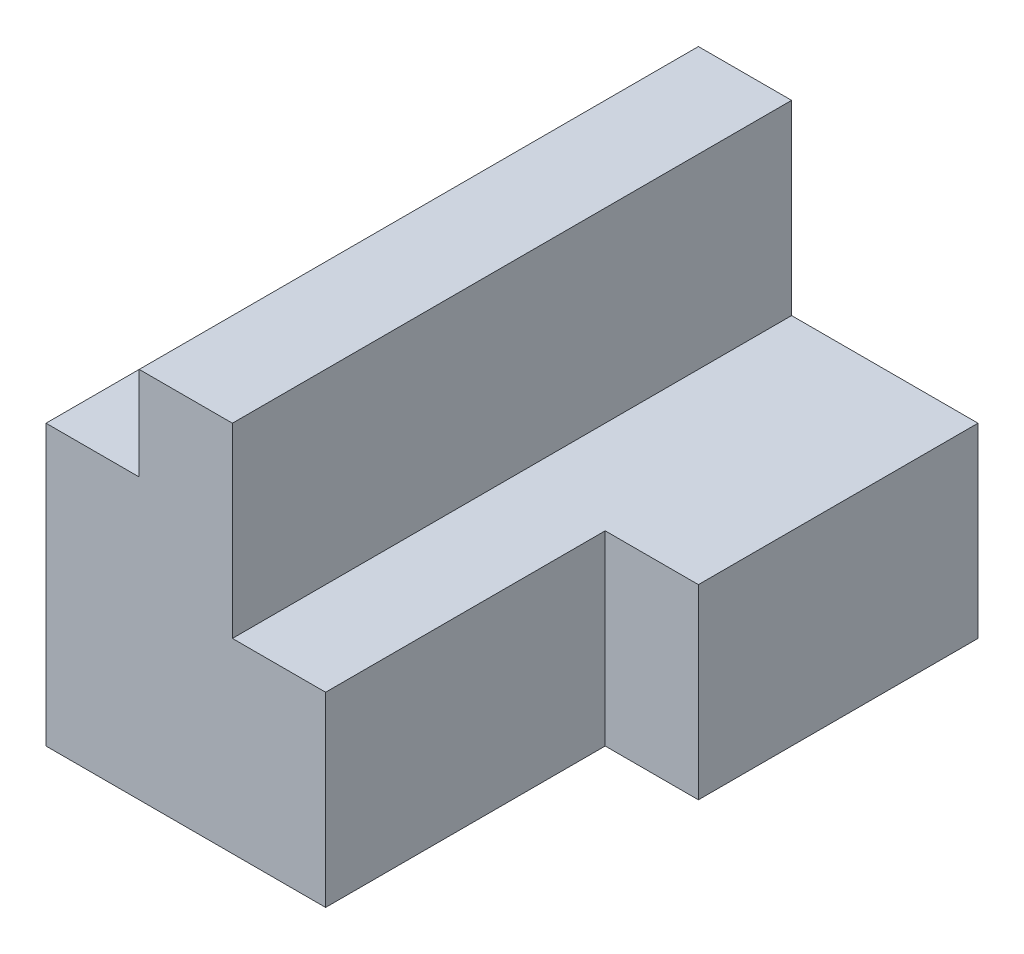
ISO-10303-21;
HEADER;
FILE_DESCRIPTION(('STEP AP214'),'2;1');
FILE_NAME('part.step','',(''),(''),'','','');
FILE_SCHEMA(('AUTOMOTIVE_DESIGN { 1 0 10303 214 1 1 1 1 }'));
ENDSEC;
DATA;
#1=APPLICATION_CONTEXT('core data for automotive mechanical design processes');
#2=APPLICATION_PROTOCOL_DEFINITION('international standard','automotive_design',2000,#1);
#3=PRODUCT_CONTEXT('',#1,'mechanical');
#4=PRODUCT('Part','Part','',(#3));
#5=PRODUCT_RELATED_PRODUCT_CATEGORY('part','',(#4));
#6=PRODUCT_DEFINITION_FORMATION('','',#4);
#7=PRODUCT_DEFINITION_CONTEXT('part definition',#1,'design');
#8=PRODUCT_DEFINITION('design','',#6,#7);
#9=PRODUCT_DEFINITION_SHAPE('','',#8);
#10=(LENGTH_UNIT() NAMED_UNIT(*) SI_UNIT(.MILLI.,.METRE.));
#11=(NAMED_UNIT(*) PLANE_ANGLE_UNIT() SI_UNIT($,.RADIAN.));
#12=(NAMED_UNIT(*) SI_UNIT($,.STERADIAN.) SOLID_ANGLE_UNIT());
#13=UNCERTAINTY_MEASURE_WITH_UNIT(LENGTH_MEASURE(1.E-05),#10,'distance_accuracy_value','');
#14=(GEOMETRIC_REPRESENTATION_CONTEXT(3) GLOBAL_UNCERTAINTY_ASSIGNED_CONTEXT((#13)) GLOBAL_UNIT_ASSIGNED_CONTEXT((#10,
#11,#12)) REPRESENTATION_CONTEXT('',''));
#15=CARTESIAN_POINT('',(0.,0.,0.));
#16=DIRECTION('',(0.,0.,1.));
#17=DIRECTION('',(1.,0.,0.));
#18=AXIS2_PLACEMENT_3D('',#15,#16,#17);
#19=CARTESIAN_POINT('',(40.,0.,60.));
#20=DIRECTION('',(-1.,0.,0.));
#21=DIRECTION('',(0.,0.,1.));
#22=AXIS2_PLACEMENT_3D('',#19,#20,#21);
#23=PLANE('',#22);
#24=DIRECTION('',(0.,0.,-1.));
#25=VECTOR('',#24,1.);
#26=CARTESIAN_POINT('',(40.,20.,60.));
#27=LINE('',#26,#25);
#28=CARTESIAN_POINT('',(40.,20.,30.));
#29=VERTEX_POINT('',#28);
#30=CARTESIAN_POINT('',(40.,20.,0.));
#31=VERTEX_POINT('',#30);
#32=EDGE_CURVE('E169',#29,#31,#27,.T.);
#33=ORIENTED_EDGE('',*,*,#32,.F.);
#34=DIRECTION('',(0.,1.,0.));
#35=VECTOR('',#34,1.);
#36=CARTESIAN_POINT('',(40.,0.,30.));
#37=LINE('',#36,#35);
#38=CARTESIAN_POINT('',(40.,0.,30.));
#39=VERTEX_POINT('',#38);
#40=EDGE_CURVE('E56',#39,#29,#37,.T.);
#41=ORIENTED_EDGE('',*,*,#40,.F.);
#42=DIRECTION('',(0.,0.,-1.));
#43=VECTOR('',#42,1.);
#44=CARTESIAN_POINT('',(40.,0.,60.));
#45=LINE('',#44,#43);
#46=CARTESIAN_POINT('',(40.,0.,0.));
#47=VERTEX_POINT('',#46);
#48=EDGE_CURVE('E41',#39,#47,#45,.T.);
#49=ORIENTED_EDGE('',*,*,#48,.T.);
#50=DIRECTION('',(0.,1.,0.));
#51=VECTOR('',#50,1.);
#52=CARTESIAN_POINT('',(40.,0.,0.));
#53=LINE('',#52,#51);
#54=EDGE_CURVE('E136',#47,#31,#53,.T.);
#55=ORIENTED_EDGE('',*,*,#54,.T.);
#56=EDGE_LOOP('',(#33,#41,#49,#55));
#57=FACE_BOUND('',#56,.T.);
#58=ADVANCED_FACE('F33',(#57),#23,.F.);
#59=CARTESIAN_POINT('',(0.,0.,60.));
#60=DIRECTION('',(1.,0.,0.));
#61=DIRECTION('',(0.,0.,-1.));
#62=AXIS2_PLACEMENT_3D('',#59,#60,#61);
#63=PLANE('',#62);
#64=DIRECTION('',(0.,-1.,0.));
#65=VECTOR('',#64,1.);
#66=CARTESIAN_POINT('',(0.,0.,60.));
#67=LINE('',#66,#65);
#68=CARTESIAN_POINT('',(0.,30.,60.));
#69=VERTEX_POINT('',#68);
#70=CARTESIAN_POINT('',(0.,0.,60.));
#71=VERTEX_POINT('',#70);
#72=EDGE_CURVE('E125',#69,#71,#67,.T.);
#73=ORIENTED_EDGE('',*,*,#72,.F.);
#74=DIRECTION('',(0.,0.,1.));
#75=VECTOR('',#74,1.);
#76=CARTESIAN_POINT('',(0.,30.,60.));
#77=LINE('',#76,#75);
#78=CARTESIAN_POINT('',(0.,30.,0.));
#79=VERTEX_POINT('',#78);
#80=EDGE_CURVE('E109',#79,#69,#77,.T.);
#81=ORIENTED_EDGE('',*,*,#80,.F.);
#82=DIRECTION('',(0.,-1.,0.));
#83=VECTOR('',#82,1.);
#84=CARTESIAN_POINT('',(0.,0.,0.));
#85=LINE('',#84,#83);
#86=CARTESIAN_POINT('',(0.,0.,0.));
#87=VERTEX_POINT('',#86);
#88=EDGE_CURVE('E143',#79,#87,#85,.T.);
#89=ORIENTED_EDGE('',*,*,#88,.T.);
#90=DIRECTION('',(0.,0.,-1.));
#91=VECTOR('',#90,1.);
#92=CARTESIAN_POINT('',(0.,0.,60.));
#93=LINE('',#92,#91);
#94=EDGE_CURVE('E11',#71,#87,#93,.T.);
#95=ORIENTED_EDGE('',*,*,#94,.F.);
#96=EDGE_LOOP('',(#73,#81,#89,#95));
#97=FACE_BOUND('',#96,.T.);
#98=ADVANCED_FACE('F35',(#97),#63,.F.);
#99=CARTESIAN_POINT('',(0.,0.,60.));
#100=DIRECTION('',(0.,1.,0.));
#101=DIRECTION('',(0.,0.,1.));
#102=AXIS2_PLACEMENT_3D('',#99,#100,#101);
#103=PLANE('',#102);
#104=DIRECTION('',(-1.,0.,0.));
#105=VECTOR('',#104,1.);
#106=CARTESIAN_POINT('',(30.,0.,30.));
#107=LINE('',#106,#105);
#108=CARTESIAN_POINT('',(30.,0.,30.));
#109=VERTEX_POINT('',#108);
#110=EDGE_CURVE('E199',#39,#109,#107,.T.);
#111=ORIENTED_EDGE('',*,*,#110,.T.);
#112=DIRECTION('',(0.,0.,1.));
#113=VECTOR('',#112,1.);
#114=CARTESIAN_POINT('',(30.,0.,60.));
#115=LINE('',#114,#113);
#116=CARTESIAN_POINT('',(30.,0.,60.));
#117=VERTEX_POINT('',#116);
#118=EDGE_CURVE('E201',#109,#117,#115,.T.);
#119=ORIENTED_EDGE('',*,*,#118,.T.);
#120=DIRECTION('',(1.,0.,0.));
#121=VECTOR('',#120,1.);
#122=CARTESIAN_POINT('',(0.,0.,60.));
#123=LINE('',#122,#121);
#124=EDGE_CURVE('E130',#71,#117,#123,.T.);
#125=ORIENTED_EDGE('',*,*,#124,.F.);
#126=ORIENTED_EDGE('',*,*,#94,.T.);
#127=DIRECTION('',(1.,0.,0.));
#128=VECTOR('',#127,1.);
#129=CARTESIAN_POINT('',(0.,0.,0.));
#130=LINE('',#129,#128);
#131=EDGE_CURVE('E145',#87,#47,#130,.T.);
#132=ORIENTED_EDGE('',*,*,#131,.T.);
#133=ORIENTED_EDGE('',*,*,#48,.F.);
#134=EDGE_LOOP('',(#111,#119,#125,#126,#132,#133));
#135=FACE_BOUND('',#134,.T.);
#136=ADVANCED_FACE('F157',(#135),#103,.F.);
#137=CARTESIAN_POINT('',(0.,40.,60.));
#138=DIRECTION('',(0.,-1.,0.));
#139=DIRECTION('',(0.,0.,-1.));
#140=AXIS2_PLACEMENT_3D('',#137,#138,#139);
#141=PLANE('',#140);
#142=DIRECTION('',(-1.,0.,0.));
#143=VECTOR('',#142,1.);
#144=CARTESIAN_POINT('',(0.,40.,0.));
#145=LINE('',#144,#143);
#146=CARTESIAN_POINT('',(20.,40.,0.));
#147=VERTEX_POINT('',#146);
#148=CARTESIAN_POINT('',(10.,40.,0.));
#149=VERTEX_POINT('',#148);
#150=EDGE_CURVE('E131',#147,#149,#145,.T.);
#151=ORIENTED_EDGE('',*,*,#150,.T.);
#152=DIRECTION('',(0.,0.,-1.));
#153=VECTOR('',#152,1.);
#154=CARTESIAN_POINT('',(10.,40.,60.));
#155=LINE('',#154,#153);
#156=CARTESIAN_POINT('',(10.,40.,60.));
#157=VERTEX_POINT('',#156);
#158=EDGE_CURVE('E119',#157,#149,#155,.T.);
#159=ORIENTED_EDGE('',*,*,#158,.F.);
#160=DIRECTION('',(-1.,0.,0.));
#161=VECTOR('',#160,1.);
#162=CARTESIAN_POINT('',(0.,40.,60.));
#163=LINE('',#162,#161);
#164=CARTESIAN_POINT('',(20.,40.,60.));
#165=VERTEX_POINT('',#164);
#166=EDGE_CURVE('E133',#165,#157,#163,.T.);
#167=ORIENTED_EDGE('',*,*,#166,.F.);
#168=DIRECTION('',(0.,0.,1.));
#169=VECTOR('',#168,1.);
#170=CARTESIAN_POINT('',(20.,40.,60.));
#171=LINE('',#170,#169);
#172=EDGE_CURVE('E173',#147,#165,#171,.T.);
#173=ORIENTED_EDGE('',*,*,#172,.F.);
#174=EDGE_LOOP('',(#151,#159,#167,#173));
#175=FACE_BOUND('',#174,.T.);
#176=ADVANCED_FACE('F187',(#175),#141,.F.);
#177=CARTESIAN_POINT('',(0.,0.,60.));
#178=DIRECTION('',(0.,0.,-1.));
#179=DIRECTION('',(-1.,0.,0.));
#180=AXIS2_PLACEMENT_3D('',#177,#178,#179);
#181=PLANE('',#180);
#182=ORIENTED_EDGE('',*,*,#166,.T.);
#183=DIRECTION('',(0.,1.,0.));
#184=VECTOR('',#183,1.);
#185=CARTESIAN_POINT('',(10.,30.,60.));
#186=LINE('',#185,#184);
#187=CARTESIAN_POINT('',(10.,30.,60.));
#188=VERTEX_POINT('',#187);
#189=EDGE_CURVE('E127',#188,#157,#186,.T.);
#190=ORIENTED_EDGE('',*,*,#189,.F.);
#191=DIRECTION('',(1.,0.,0.));
#192=VECTOR('',#191,1.);
#193=CARTESIAN_POINT('',(0.,30.,60.));
#194=LINE('',#193,#192);
#195=EDGE_CURVE('E112',#69,#188,#194,.T.);
#196=ORIENTED_EDGE('',*,*,#195,.F.);
#197=ORIENTED_EDGE('',*,*,#72,.T.);
#198=ORIENTED_EDGE('',*,*,#124,.T.);
#199=DIRECTION('',(0.,1.,0.));
#200=VECTOR('',#199,1.);
#201=CARTESIAN_POINT('',(30.,0.,60.));
#202=LINE('',#201,#200);
#203=CARTESIAN_POINT('',(30.,20.,60.));
#204=VERTEX_POINT('',#203);
#205=EDGE_CURVE('E179',#117,#204,#202,.T.);
#206=ORIENTED_EDGE('',*,*,#205,.T.);
#207=DIRECTION('',(1.,0.,0.));
#208=VECTOR('',#207,1.);
#209=CARTESIAN_POINT('',(40.,20.,60.));
#210=LINE('',#209,#208);
#211=CARTESIAN_POINT('',(20.,20.,60.));
#212=VERTEX_POINT('',#211);
#213=EDGE_CURVE('E171',#212,#204,#210,.T.);
#214=ORIENTED_EDGE('',*,*,#213,.F.);
#215=DIRECTION('',(0.,1.,0.));
#216=VECTOR('',#215,1.);
#217=CARTESIAN_POINT('',(20.,20.,60.));
#218=LINE('',#217,#216);
#219=EDGE_CURVE('E146',#212,#165,#218,.T.);
#220=ORIENTED_EDGE('',*,*,#219,.T.);
#221=EDGE_LOOP('',(#182,#190,#196,#197,#198,#206,#214,#220));
#222=FACE_BOUND('',#221,.T.);
#223=ADVANCED_FACE('F123',(#222),#181,.F.);
#224=CARTESIAN_POINT('',(0.,0.,0.));
#225=DIRECTION('',(0.,0.,-1.));
#226=DIRECTION('',(-1.,0.,0.));
#227=AXIS2_PLACEMENT_3D('',#224,#225,#226);
#228=PLANE('',#227);
#229=DIRECTION('',(0.,1.,0.));
#230=VECTOR('',#229,1.);
#231=CARTESIAN_POINT('',(10.,30.,0.));
#232=LINE('',#231,#230);
#233=CARTESIAN_POINT('',(10.,30.,0.));
#234=VERTEX_POINT('',#233);
#235=EDGE_CURVE('E189',#234,#149,#232,.T.);
#236=ORIENTED_EDGE('',*,*,#235,.T.);
#237=ORIENTED_EDGE('',*,*,#150,.F.);
#238=DIRECTION('',(0.,1.,0.));
#239=VECTOR('',#238,1.);
#240=CARTESIAN_POINT('',(20.,20.,0.));
#241=LINE('',#240,#239);
#242=CARTESIAN_POINT('',(20.,20.,0.));
#243=VERTEX_POINT('',#242);
#244=EDGE_CURVE('E139',#243,#147,#241,.T.);
#245=ORIENTED_EDGE('',*,*,#244,.F.);
#246=DIRECTION('',(-1.,0.,0.));
#247=VECTOR('',#246,1.);
#248=CARTESIAN_POINT('',(40.,20.,0.));
#249=LINE('',#248,#247);
#250=EDGE_CURVE('E164',#31,#243,#249,.T.);
#251=ORIENTED_EDGE('',*,*,#250,.F.);
#252=ORIENTED_EDGE('',*,*,#54,.F.);
#253=ORIENTED_EDGE('',*,*,#131,.F.);
#254=ORIENTED_EDGE('',*,*,#88,.F.);
#255=DIRECTION('',(-1.,0.,0.));
#256=VECTOR('',#255,1.);
#257=CARTESIAN_POINT('',(0.,30.,0.));
#258=LINE('',#257,#256);
#259=EDGE_CURVE('E115',#234,#79,#258,.T.);
#260=ORIENTED_EDGE('',*,*,#259,.F.);
#261=EDGE_LOOP('',(#236,#237,#245,#251,#252,#253,#254,#260));
#262=FACE_BOUND('',#261,.T.);
#263=ADVANCED_FACE('F161',(#262),#228,.T.);
#264=CARTESIAN_POINT('',(20.,20.,60.));
#265=DIRECTION('',(-1.,0.,0.));
#266=DIRECTION('',(0.,0.,1.));
#267=AXIS2_PLACEMENT_3D('',#264,#265,#266);
#268=PLANE('',#267);
#269=ORIENTED_EDGE('',*,*,#172,.T.);
#270=ORIENTED_EDGE('',*,*,#219,.F.);
#271=DIRECTION('',(0.,0.,1.));
#272=VECTOR('',#271,1.);
#273=CARTESIAN_POINT('',(20.,20.,60.));
#274=LINE('',#273,#272);
#275=EDGE_CURVE('E168',#243,#212,#274,.T.);
#276=ORIENTED_EDGE('',*,*,#275,.F.);
#277=ORIENTED_EDGE('',*,*,#244,.T.);
#278=EDGE_LOOP('',(#269,#270,#276,#277));
#279=FACE_BOUND('',#278,.T.);
#280=ADVANCED_FACE('F185',(#279),#268,.F.);
#281=CARTESIAN_POINT('',(0.,20.,0.));
#282=DIRECTION('',(0.,1.,0.));
#283=DIRECTION('',(0.,0.,1.));
#284=AXIS2_PLACEMENT_3D('',#281,#282,#283);
#285=PLANE('',#284);
#286=DIRECTION('',(0.,0.,1.));
#287=VECTOR('',#286,1.);
#288=CARTESIAN_POINT('',(30.,20.,60.));
#289=LINE('',#288,#287);
#290=CARTESIAN_POINT('',(30.,20.,30.));
#291=VERTEX_POINT('',#290);
#292=EDGE_CURVE('E193',#291,#204,#289,.T.);
#293=ORIENTED_EDGE('',*,*,#292,.F.);
#294=DIRECTION('',(-1.,0.,0.));
#295=VECTOR('',#294,1.);
#296=CARTESIAN_POINT('',(30.,20.,30.));
#297=LINE('',#296,#295);
#298=EDGE_CURVE('E191',#29,#291,#297,.T.);
#299=ORIENTED_EDGE('',*,*,#298,.F.);
#300=ORIENTED_EDGE('',*,*,#32,.T.);
#301=ORIENTED_EDGE('',*,*,#250,.T.);
#302=ORIENTED_EDGE('',*,*,#275,.T.);
#303=ORIENTED_EDGE('',*,*,#213,.T.);
#304=EDGE_LOOP('',(#293,#299,#300,#301,#302,#303));
#305=FACE_BOUND('',#304,.T.);
#306=ADVANCED_FACE('F213',(#305),#285,.T.);
#307=CARTESIAN_POINT('',(30.,0.,60.));
#308=DIRECTION('',(-1.,0.,0.));
#309=DIRECTION('',(0.,0.,1.));
#310=AXIS2_PLACEMENT_3D('',#307,#308,#309);
#311=PLANE('',#310);
#312=ORIENTED_EDGE('',*,*,#292,.T.);
#313=ORIENTED_EDGE('',*,*,#205,.F.);
#314=ORIENTED_EDGE('',*,*,#118,.F.);
#315=DIRECTION('',(0.,1.,0.));
#316=VECTOR('',#315,1.);
#317=CARTESIAN_POINT('',(30.,0.,30.));
#318=LINE('',#317,#316);
#319=EDGE_CURVE('E207',#109,#291,#318,.T.);
#320=ORIENTED_EDGE('',*,*,#319,.T.);
#321=EDGE_LOOP('',(#312,#313,#314,#320));
#322=FACE_BOUND('',#321,.T.);
#323=ADVANCED_FACE('F210',(#322),#311,.F.);
#324=CARTESIAN_POINT('',(30.,0.,30.));
#325=DIRECTION('',(0.,0.,-1.));
#326=DIRECTION('',(-1.,0.,0.));
#327=AXIS2_PLACEMENT_3D('',#324,#325,#326);
#328=PLANE('',#327);
#329=ORIENTED_EDGE('',*,*,#298,.T.);
#330=ORIENTED_EDGE('',*,*,#319,.F.);
#331=ORIENTED_EDGE('',*,*,#110,.F.);
#332=ORIENTED_EDGE('',*,*,#40,.T.);
#333=EDGE_LOOP('',(#329,#330,#331,#332));
#334=FACE_BOUND('',#333,.T.);
#335=ADVANCED_FACE('F212',(#334),#328,.F.);
#336=CARTESIAN_POINT('',(10.,30.,60.));
#337=DIRECTION('',(1.,0.,0.));
#338=DIRECTION('',(0.,0.,-1.));
#339=AXIS2_PLACEMENT_3D('',#336,#337,#338);
#340=PLANE('',#339);
#341=ORIENTED_EDGE('',*,*,#158,.T.);
#342=ORIENTED_EDGE('',*,*,#235,.F.);
#343=DIRECTION('',(0.,0.,-1.));
#344=VECTOR('',#343,1.);
#345=CARTESIAN_POINT('',(10.,30.,60.));
#346=LINE('',#345,#344);
#347=EDGE_CURVE('E48',#188,#234,#346,.T.);
#348=ORIENTED_EDGE('',*,*,#347,.F.);
#349=ORIENTED_EDGE('',*,*,#189,.T.);
#350=EDGE_LOOP('',(#341,#342,#348,#349));
#351=FACE_BOUND('',#350,.T.);
#352=ADVANCED_FACE('F277',(#351),#340,.F.);
#353=CARTESIAN_POINT('',(0.,30.,0.));
#354=DIRECTION('',(0.,-1.,0.));
#355=DIRECTION('',(0.,0.,-1.));
#356=AXIS2_PLACEMENT_3D('',#353,#354,#355);
#357=PLANE('',#356);
#358=ORIENTED_EDGE('',*,*,#80,.T.);
#359=ORIENTED_EDGE('',*,*,#195,.T.);
#360=ORIENTED_EDGE('',*,*,#347,.T.);
#361=ORIENTED_EDGE('',*,*,#259,.T.);
#362=EDGE_LOOP('',(#358,#359,#360,#361));
#363=FACE_BOUND('',#362,.T.);
#364=ADVANCED_FACE('F111',(#363),#357,.F.);
#365=CLOSED_SHELL('',(#58,#98,#136,#176,#223,#263,#280,#306,#323,#335,#352,#364));
#366=MANIFOLD_SOLID_BREP('B2',#365);
#367=ADVANCED_BREP_SHAPE_REPRESENTATION('',(#18,#366),#14);
#368=SHAPE_DEFINITION_REPRESENTATION(#9,#367);
ENDSEC;
END-ISO-10303-21;
